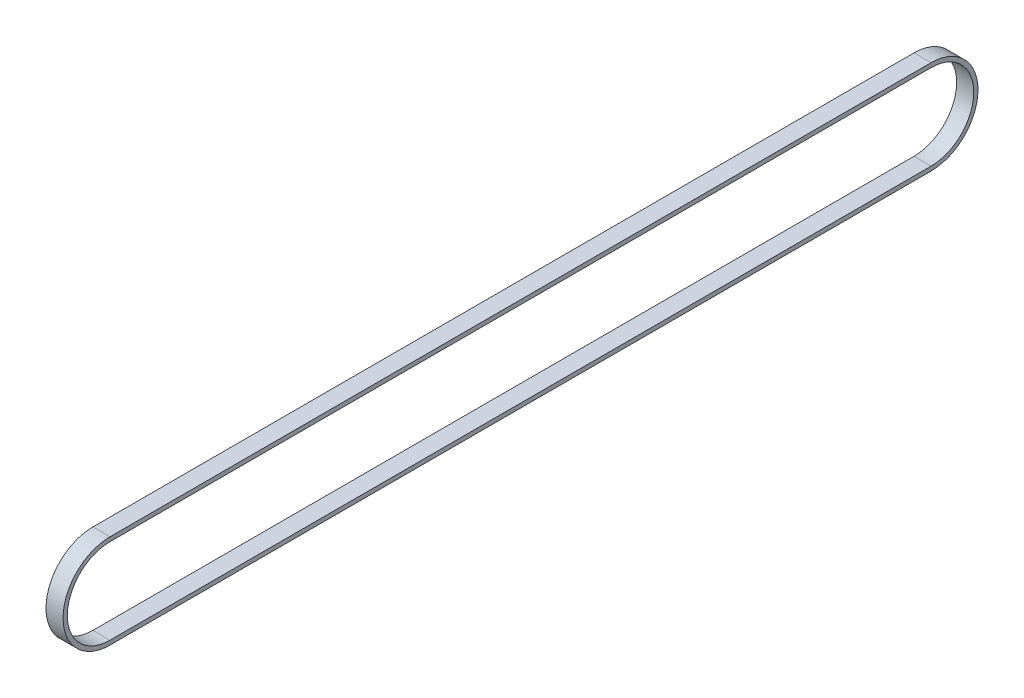
ISO-10303-21;
HEADER;
FILE_DESCRIPTION(('STEP AP214'),'2;1');
FILE_NAME('part.step','',(''),(''),'','','');
FILE_SCHEMA(('AUTOMOTIVE_DESIGN { 1 0 10303 214 1 1 1 1 }'));
ENDSEC;
DATA;
#1=APPLICATION_CONTEXT('core data for automotive mechanical design processes');
#2=APPLICATION_PROTOCOL_DEFINITION('international standard','automotive_design',2000,#1);
#3=PRODUCT_CONTEXT('',#1,'mechanical');
#4=PRODUCT('Part','Part','',(#3));
#5=PRODUCT_RELATED_PRODUCT_CATEGORY('part','',(#4));
#6=PRODUCT_DEFINITION_FORMATION('','',#4);
#7=PRODUCT_DEFINITION_CONTEXT('part definition',#1,'design');
#8=PRODUCT_DEFINITION('design','',#6,#7);
#9=PRODUCT_DEFINITION_SHAPE('','',#8);
#10=(LENGTH_UNIT() NAMED_UNIT(*) SI_UNIT(.MILLI.,.METRE.));
#11=(NAMED_UNIT(*) PLANE_ANGLE_UNIT() SI_UNIT($,.RADIAN.));
#12=(NAMED_UNIT(*) SI_UNIT($,.STERADIAN.) SOLID_ANGLE_UNIT());
#13=UNCERTAINTY_MEASURE_WITH_UNIT(LENGTH_MEASURE(1.E-05),#10,'distance_accuracy_value','');
#14=(GEOMETRIC_REPRESENTATION_CONTEXT(3) GLOBAL_UNCERTAINTY_ASSIGNED_CONTEXT((#13)) GLOBAL_UNIT_ASSIGNED_CONTEXT((#10,
#11,#12)) REPRESENTATION_CONTEXT('',''));
#15=CARTESIAN_POINT('',(0.,0.,0.));
#16=DIRECTION('',(0.,0.,1.));
#17=DIRECTION('',(1.,0.,0.));
#18=AXIS2_PLACEMENT_3D('',#15,#16,#17);
#19=CARTESIAN_POINT('',(4.,0.,192.5));
#20=DIRECTION('',(1.,0.,0.));
#21=DIRECTION('',(0.,0.,-1.));
#22=AXIS2_PLACEMENT_3D('',#19,#20,#21);
#23=PLANE('',#22);
#24=CARTESIAN_POINT('',(4.,0.,192.5));
#25=DIRECTION('',(1.,0.,0.));
#26=DIRECTION('',(0.,0.,-1.));
#27=AXIS2_PLACEMENT_3D('',#24,#25,#26);
#28=CIRCLE('',#27,22.0000000000001);
#29=CARTESIAN_POINT('',(4.,22.0000000000001,192.5));
#30=VERTEX_POINT('',#29);
#31=CARTESIAN_POINT('',(4.,-22.0000000000001,192.5));
#32=VERTEX_POINT('',#31);
#33=EDGE_CURVE('E160',#30,#32,#28,.T.);
#34=ORIENTED_EDGE('',*,*,#33,.T.);
#35=DIRECTION('',(0.,0.,-1.));
#36=VECTOR('',#35,1.);
#37=CARTESIAN_POINT('',(4.,-22.0000000000001,192.5));
#38=LINE('',#37,#36);
#39=CARTESIAN_POINT('',(4.,-22.,-192.5));
#40=VERTEX_POINT('',#39);
#41=EDGE_CURVE('E163',#32,#40,#38,.T.);
#42=ORIENTED_EDGE('',*,*,#41,.T.);
#43=CARTESIAN_POINT('',(4.,0.,-192.5));
#44=DIRECTION('',(1.,0.,0.));
#45=DIRECTION('',(0.,0.,-1.));
#46=AXIS2_PLACEMENT_3D('',#43,#44,#45);
#47=CIRCLE('',#46,22.0000000000001);
#48=CARTESIAN_POINT('',(4.,22.0000000000001,-192.5));
#49=VERTEX_POINT('',#48);
#50=EDGE_CURVE('E166',#40,#49,#47,.T.);
#51=ORIENTED_EDGE('',*,*,#50,.T.);
#52=DIRECTION('',(0.,0.,1.));
#53=VECTOR('',#52,1.);
#54=CARTESIAN_POINT('',(4.,22.0000000000001,192.5));
#55=LINE('',#54,#53);
#56=EDGE_CURVE('E168',#49,#30,#55,.T.);
#57=ORIENTED_EDGE('',*,*,#56,.T.);
#58=EDGE_LOOP('',(#34,#42,#51,#57));
#59=FACE_BOUND('',#58,.T.);
#60=DIRECTION('',(0.,0.,-1.));
#61=VECTOR('',#60,1.);
#62=CARTESIAN_POINT('',(4.,-20.0000000000001,192.5));
#63=LINE('',#62,#61);
#64=CARTESIAN_POINT('',(4.,-20.0000000000001,192.5));
#65=VERTEX_POINT('',#64);
#66=CARTESIAN_POINT('',(4.,-20.,-192.5));
#67=VERTEX_POINT('',#66);
#68=EDGE_CURVE('E132',#65,#67,#63,.T.);
#69=ORIENTED_EDGE('',*,*,#68,.F.);
#70=CARTESIAN_POINT('',(4.,0.,192.5));
#71=DIRECTION('',(1.,0.,0.));
#72=DIRECTION('',(0.,0.,-1.));
#73=AXIS2_PLACEMENT_3D('',#70,#71,#72);
#74=CIRCLE('',#73,20.0000000000001);
#75=CARTESIAN_POINT('',(4.,20.0000000000001,192.5));
#76=VERTEX_POINT('',#75);
#77=EDGE_CURVE('E124',#76,#65,#74,.T.);
#78=ORIENTED_EDGE('',*,*,#77,.F.);
#79=DIRECTION('',(0.,0.,1.));
#80=VECTOR('',#79,1.);
#81=CARTESIAN_POINT('',(4.,20.0000000000001,192.5));
#82=LINE('',#81,#80);
#83=CARTESIAN_POINT('',(4.,20.0000000000001,-192.5));
#84=VERTEX_POINT('',#83);
#85=EDGE_CURVE('E146',#84,#76,#82,.T.);
#86=ORIENTED_EDGE('',*,*,#85,.F.);
#87=CARTESIAN_POINT('',(4.,0.,-192.5));
#88=DIRECTION('',(1.,0.,0.));
#89=DIRECTION('',(0.,0.,-1.));
#90=AXIS2_PLACEMENT_3D('',#87,#88,#89);
#91=CIRCLE('',#90,20.0000000000001);
#92=EDGE_CURVE('E144',#67,#84,#91,.T.);
#93=ORIENTED_EDGE('',*,*,#92,.F.);
#94=EDGE_LOOP('',(#69,#78,#86,#93));
#95=FACE_BOUND('',#94,.T.);
#96=ADVANCED_FACE('F59',(#59,#95),#23,.T.);
#97=CARTESIAN_POINT('',(-4.,0.,192.5));
#98=DIRECTION('',(1.,0.,0.));
#99=DIRECTION('',(0.,0.,-1.));
#100=AXIS2_PLACEMENT_3D('',#97,#98,#99);
#101=PLANE('',#100);
#102=CARTESIAN_POINT('',(-4.,0.,192.5));
#103=DIRECTION('',(1.,0.,0.));
#104=DIRECTION('',(0.,0.,-1.));
#105=AXIS2_PLACEMENT_3D('',#102,#103,#104);
#106=CIRCLE('',#105,22.0000000000001);
#107=CARTESIAN_POINT('',(-4.,22.0000000000001,192.5));
#108=VERTEX_POINT('',#107);
#109=CARTESIAN_POINT('',(-4.,-22.0000000000001,192.5));
#110=VERTEX_POINT('',#109);
#111=EDGE_CURVE('E140',#108,#110,#106,.T.);
#112=ORIENTED_EDGE('',*,*,#111,.F.);
#113=DIRECTION('',(0.,0.,1.));
#114=VECTOR('',#113,1.);
#115=CARTESIAN_POINT('',(-4.,22.0000000000001,192.5));
#116=LINE('',#115,#114);
#117=CARTESIAN_POINT('',(-4.,22.0000000000001,-192.5));
#118=VERTEX_POINT('',#117);
#119=EDGE_CURVE('E164',#118,#108,#116,.T.);
#120=ORIENTED_EDGE('',*,*,#119,.F.);
#121=CARTESIAN_POINT('',(-4.,0.,-192.5));
#122=DIRECTION('',(1.,0.,0.));
#123=DIRECTION('',(0.,0.,-1.));
#124=AXIS2_PLACEMENT_3D('',#121,#122,#123);
#125=CIRCLE('',#124,22.0000000000001);
#126=CARTESIAN_POINT('',(-4.,-22.,-192.5));
#127=VERTEX_POINT('',#126);
#128=EDGE_CURVE('E175',#127,#118,#125,.T.);
#129=ORIENTED_EDGE('',*,*,#128,.F.);
#130=DIRECTION('',(0.,0.,-1.));
#131=VECTOR('',#130,1.);
#132=CARTESIAN_POINT('',(-4.,-22.0000000000001,192.5));
#133=LINE('',#132,#131);
#134=EDGE_CURVE('E173',#110,#127,#133,.T.);
#135=ORIENTED_EDGE('',*,*,#134,.F.);
#136=EDGE_LOOP('',(#112,#120,#129,#135));
#137=FACE_BOUND('',#136,.T.);
#138=CARTESIAN_POINT('',(-4.,0.,192.5));
#139=DIRECTION('',(1.,0.,0.));
#140=DIRECTION('',(0.,0.,-1.));
#141=AXIS2_PLACEMENT_3D('',#138,#139,#140);
#142=CIRCLE('',#141,20.0000000000001);
#143=CARTESIAN_POINT('',(-4.,20.0000000000001,192.5));
#144=VERTEX_POINT('',#143);
#145=CARTESIAN_POINT('',(-4.,-20.0000000000001,192.5));
#146=VERTEX_POINT('',#145);
#147=EDGE_CURVE('E82',#144,#146,#142,.T.);
#148=ORIENTED_EDGE('',*,*,#147,.T.);
#149=DIRECTION('',(0.,0.,-1.));
#150=VECTOR('',#149,1.);
#151=CARTESIAN_POINT('',(-4.,-20.0000000000001,192.5));
#152=LINE('',#151,#150);
#153=CARTESIAN_POINT('',(-4.,-20.,-192.5));
#154=VERTEX_POINT('',#153);
#155=EDGE_CURVE('E139',#146,#154,#152,.T.);
#156=ORIENTED_EDGE('',*,*,#155,.T.);
#157=CARTESIAN_POINT('',(-4.,0.,-192.5));
#158=DIRECTION('',(1.,0.,0.));
#159=DIRECTION('',(0.,0.,-1.));
#160=AXIS2_PLACEMENT_3D('',#157,#158,#159);
#161=CIRCLE('',#160,20.0000000000001);
#162=CARTESIAN_POINT('',(-4.,20.0000000000001,-192.5));
#163=VERTEX_POINT('',#162);
#164=EDGE_CURVE('E152',#154,#163,#161,.T.);
#165=ORIENTED_EDGE('',*,*,#164,.T.);
#166=DIRECTION('',(0.,0.,1.));
#167=VECTOR('',#166,1.);
#168=CARTESIAN_POINT('',(-4.,20.0000000000001,192.5));
#169=LINE('',#168,#167);
#170=EDGE_CURVE('E133',#163,#144,#169,.T.);
#171=ORIENTED_EDGE('',*,*,#170,.T.);
#172=EDGE_LOOP('',(#148,#156,#165,#171));
#173=FACE_BOUND('',#172,.T.);
#174=ADVANCED_FACE('F193',(#137,#173),#101,.F.);
#175=CARTESIAN_POINT('',(4.,0.,192.5));
#176=DIRECTION('',(-1.,0.,0.));
#177=DIRECTION('',(0.,0.,1.));
#178=AXIS2_PLACEMENT_3D('',#175,#176,#177);
#179=CYLINDRICAL_SURFACE('',#178,22.0000000000001);
#180=ORIENTED_EDGE('',*,*,#111,.T.);
#181=DIRECTION('',(-1.,0.,0.));
#182=VECTOR('',#181,1.);
#183=CARTESIAN_POINT('',(4.,-22.0000000000001,192.5));
#184=LINE('',#183,#182);
#185=EDGE_CURVE('E12',#32,#110,#184,.T.);
#186=ORIENTED_EDGE('',*,*,#185,.F.);
#187=ORIENTED_EDGE('',*,*,#33,.F.);
#188=DIRECTION('',(-1.,0.,0.));
#189=VECTOR('',#188,1.);
#190=CARTESIAN_POINT('',(4.,22.0000000000001,192.5));
#191=LINE('',#190,#189);
#192=EDGE_CURVE('E170',#30,#108,#191,.T.);
#193=ORIENTED_EDGE('',*,*,#192,.T.);
#194=EDGE_LOOP('',(#180,#186,#187,#193));
#195=FACE_BOUND('',#194,.T.);
#196=ADVANCED_FACE('F61',(#195),#179,.T.);
#197=CARTESIAN_POINT('',(4.,-22.0000000000001,192.5));
#198=DIRECTION('',(0.,1.,0.));
#199=DIRECTION('',(0.,0.,1.));
#200=AXIS2_PLACEMENT_3D('',#197,#198,#199);
#201=PLANE('',#200);
#202=ORIENTED_EDGE('',*,*,#134,.T.);
#203=DIRECTION('',(-1.,0.,0.));
#204=VECTOR('',#203,1.);
#205=CARTESIAN_POINT('',(4.,-22.,-192.5));
#206=LINE('',#205,#204);
#207=EDGE_CURVE('E67',#40,#127,#206,.T.);
#208=ORIENTED_EDGE('',*,*,#207,.F.);
#209=ORIENTED_EDGE('',*,*,#41,.F.);
#210=ORIENTED_EDGE('',*,*,#185,.T.);
#211=EDGE_LOOP('',(#202,#208,#209,#210));
#212=FACE_BOUND('',#211,.T.);
#213=ADVANCED_FACE('F203',(#212),#201,.F.);
#214=CARTESIAN_POINT('',(4.,0.,-192.5));
#215=DIRECTION('',(-1.,0.,0.));
#216=DIRECTION('',(0.,0.,1.));
#217=AXIS2_PLACEMENT_3D('',#214,#215,#216);
#218=CYLINDRICAL_SURFACE('',#217,22.0000000000001);
#219=ORIENTED_EDGE('',*,*,#128,.T.);
#220=DIRECTION('',(-1.,0.,0.));
#221=VECTOR('',#220,1.);
#222=CARTESIAN_POINT('',(4.,22.0000000000001,-192.5));
#223=LINE('',#222,#221);
#224=EDGE_CURVE('E180',#49,#118,#223,.T.);
#225=ORIENTED_EDGE('',*,*,#224,.F.);
#226=ORIENTED_EDGE('',*,*,#50,.F.);
#227=ORIENTED_EDGE('',*,*,#207,.T.);
#228=EDGE_LOOP('',(#219,#225,#226,#227));
#229=FACE_BOUND('',#228,.T.);
#230=ADVANCED_FACE('F187',(#229),#218,.T.);
#231=CARTESIAN_POINT('',(4.,22.0000000000001,192.5));
#232=DIRECTION('',(0.,-1.,0.));
#233=DIRECTION('',(0.,0.,-1.));
#234=AXIS2_PLACEMENT_3D('',#231,#232,#233);
#235=PLANE('',#234);
#236=ORIENTED_EDGE('',*,*,#119,.T.);
#237=ORIENTED_EDGE('',*,*,#192,.F.);
#238=ORIENTED_EDGE('',*,*,#56,.F.);
#239=ORIENTED_EDGE('',*,*,#224,.T.);
#240=EDGE_LOOP('',(#236,#237,#238,#239));
#241=FACE_BOUND('',#240,.T.);
#242=ADVANCED_FACE('F197',(#241),#235,.F.);
#243=CARTESIAN_POINT('',(4.,0.,192.5));
#244=DIRECTION('',(-1.,0.,0.));
#245=DIRECTION('',(0.,0.,1.));
#246=AXIS2_PLACEMENT_3D('',#243,#244,#245);
#247=CYLINDRICAL_SURFACE('',#246,20.0000000000001);
#248=ORIENTED_EDGE('',*,*,#147,.F.);
#249=DIRECTION('',(-1.,0.,0.));
#250=VECTOR('',#249,1.);
#251=CARTESIAN_POINT('',(4.,20.0000000000001,192.5));
#252=LINE('',#251,#250);
#253=EDGE_CURVE('E128',#76,#144,#252,.T.);
#254=ORIENTED_EDGE('',*,*,#253,.F.);
#255=ORIENTED_EDGE('',*,*,#77,.T.);
#256=DIRECTION('',(-1.,0.,0.));
#257=VECTOR('',#256,1.);
#258=CARTESIAN_POINT('',(4.,-20.0000000000001,192.5));
#259=LINE('',#258,#257);
#260=EDGE_CURVE('E127',#65,#146,#259,.T.);
#261=ORIENTED_EDGE('',*,*,#260,.T.);
#262=EDGE_LOOP('',(#248,#254,#255,#261));
#263=FACE_BOUND('',#262,.T.);
#264=ADVANCED_FACE('F126',(#263),#247,.F.);
#265=CARTESIAN_POINT('',(4.,-20.0000000000001,192.5));
#266=DIRECTION('',(0.,1.,0.));
#267=DIRECTION('',(0.,0.,1.));
#268=AXIS2_PLACEMENT_3D('',#265,#266,#267);
#269=PLANE('',#268);
#270=ORIENTED_EDGE('',*,*,#155,.F.);
#271=ORIENTED_EDGE('',*,*,#260,.F.);
#272=ORIENTED_EDGE('',*,*,#68,.T.);
#273=DIRECTION('',(-1.,0.,0.));
#274=VECTOR('',#273,1.);
#275=CARTESIAN_POINT('',(4.,-20.,-192.5));
#276=LINE('',#275,#274);
#277=EDGE_CURVE('E141',#67,#154,#276,.T.);
#278=ORIENTED_EDGE('',*,*,#277,.T.);
#279=EDGE_LOOP('',(#270,#271,#272,#278));
#280=FACE_BOUND('',#279,.T.);
#281=ADVANCED_FACE('F136',(#280),#269,.T.);
#282=CARTESIAN_POINT('',(4.,0.,-192.5));
#283=DIRECTION('',(-1.,0.,0.));
#284=DIRECTION('',(0.,0.,1.));
#285=AXIS2_PLACEMENT_3D('',#282,#283,#284);
#286=CYLINDRICAL_SURFACE('',#285,20.0000000000001);
#287=ORIENTED_EDGE('',*,*,#164,.F.);
#288=ORIENTED_EDGE('',*,*,#277,.F.);
#289=ORIENTED_EDGE('',*,*,#92,.T.);
#290=DIRECTION('',(-1.,0.,0.));
#291=VECTOR('',#290,1.);
#292=CARTESIAN_POINT('',(4.,20.0000000000001,-192.5));
#293=LINE('',#292,#291);
#294=EDGE_CURVE('E74',#84,#163,#293,.T.);
#295=ORIENTED_EDGE('',*,*,#294,.T.);
#296=EDGE_LOOP('',(#287,#288,#289,#295));
#297=FACE_BOUND('',#296,.T.);
#298=ADVANCED_FACE('F226',(#297),#286,.F.);
#299=CARTESIAN_POINT('',(4.,20.0000000000001,192.5));
#300=DIRECTION('',(0.,-1.,0.));
#301=DIRECTION('',(0.,0.,-1.));
#302=AXIS2_PLACEMENT_3D('',#299,#300,#301);
#303=PLANE('',#302);
#304=ORIENTED_EDGE('',*,*,#170,.F.);
#305=ORIENTED_EDGE('',*,*,#294,.F.);
#306=ORIENTED_EDGE('',*,*,#85,.T.);
#307=ORIENTED_EDGE('',*,*,#253,.T.);
#308=EDGE_LOOP('',(#304,#305,#306,#307));
#309=FACE_BOUND('',#308,.T.);
#310=ADVANCED_FACE('F230',(#309),#303,.T.);
#311=CLOSED_SHELL('',(#96,#174,#196,#213,#230,#242,#264,#281,#298,#310));
#312=MANIFOLD_SOLID_BREP('B2',#311);
#313=ADVANCED_BREP_SHAPE_REPRESENTATION('',(#18,#312),#14);
#314=SHAPE_DEFINITION_REPRESENTATION(#9,#313);
ENDSEC;
END-ISO-10303-21;
